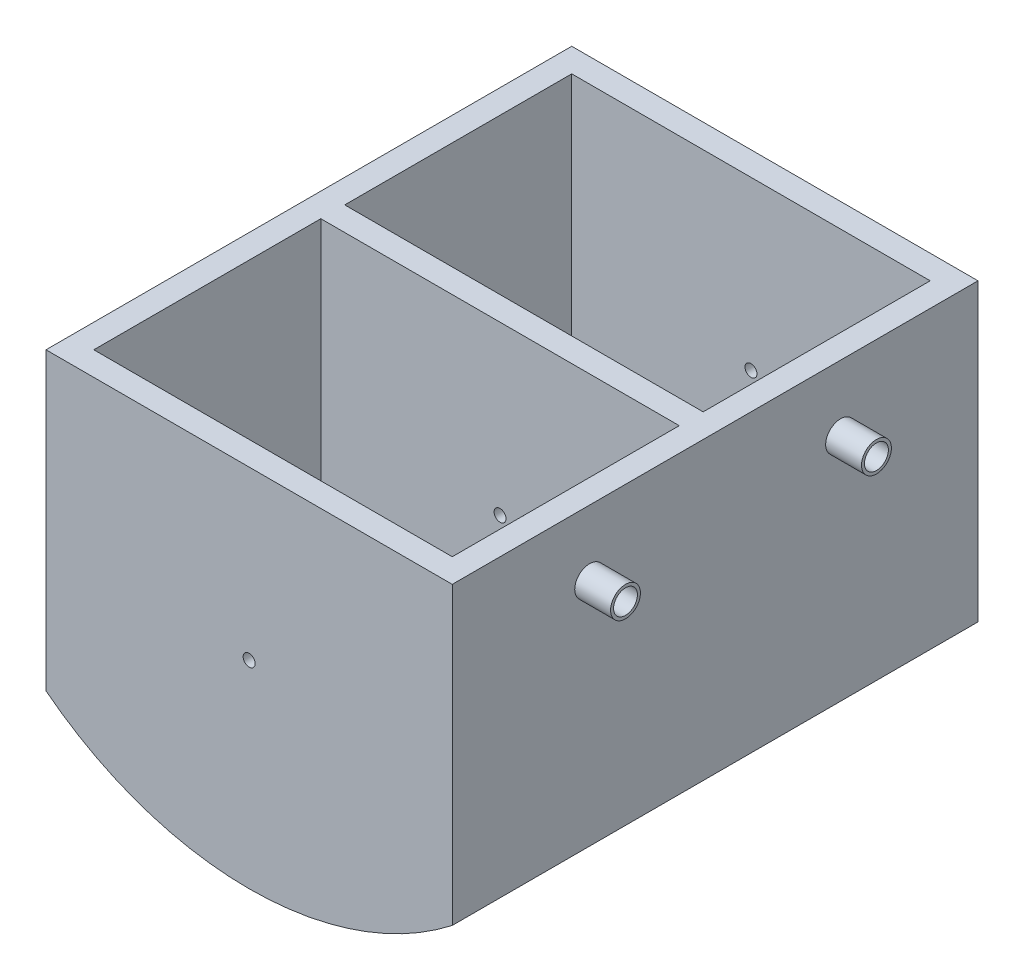
ISO-10303-21;
HEADER;
FILE_DESCRIPTION(('STEP AP214'),'2;1');
FILE_NAME('part.step','',(''),(''),'','','');
FILE_SCHEMA(('AUTOMOTIVE_DESIGN { 1 0 10303 214 1 1 1 1 }'));
ENDSEC;
DATA;
#1=APPLICATION_CONTEXT('core data for automotive mechanical design processes');
#2=APPLICATION_PROTOCOL_DEFINITION('international standard','automotive_design',2000,#1);
#3=PRODUCT_CONTEXT('',#1,'mechanical');
#4=PRODUCT('Part','Part','',(#3));
#5=PRODUCT_RELATED_PRODUCT_CATEGORY('part','',(#4));
#6=PRODUCT_DEFINITION_FORMATION('','',#4);
#7=PRODUCT_DEFINITION_CONTEXT('part definition',#1,'design');
#8=PRODUCT_DEFINITION('design','',#6,#7);
#9=PRODUCT_DEFINITION_SHAPE('','',#8);
#10=(LENGTH_UNIT() NAMED_UNIT(*) SI_UNIT(.MILLI.,.METRE.));
#11=(NAMED_UNIT(*) PLANE_ANGLE_UNIT() SI_UNIT($,.RADIAN.));
#12=(NAMED_UNIT(*) SI_UNIT($,.STERADIAN.) SOLID_ANGLE_UNIT());
#13=UNCERTAINTY_MEASURE_WITH_UNIT(LENGTH_MEASURE(1.E-05),#10,'distance_accuracy_value','');
#14=(GEOMETRIC_REPRESENTATION_CONTEXT(3) GLOBAL_UNCERTAINTY_ASSIGNED_CONTEXT((#13)) GLOBAL_UNIT_ASSIGNED_CONTEXT((#10,
#11,#12)) REPRESENTATION_CONTEXT('',''));
#15=CARTESIAN_POINT('',(0.,0.,0.));
#16=DIRECTION('',(0.,0.,1.));
#17=DIRECTION('',(1.,0.,0.));
#18=AXIS2_PLACEMENT_3D('',#15,#16,#17);
#19=CARTESIAN_POINT('',(170.,140.,440.));
#20=DIRECTION('',(-1.,0.,0.));
#21=DIRECTION('',(0.,0.,1.));
#22=AXIS2_PLACEMENT_3D('',#19,#20,#21);
#23=PLANE('',#22);
#24=CARTESIAN_POINT('',(170.,85.,325.));
#25=DIRECTION('',(-1.,0.,0.));
#26=DIRECTION('',(0.,0.,1.));
#27=AXIS2_PLACEMENT_3D('',#24,#25,#26);
#28=CIRCLE('',#27,12.5);
#29=CARTESIAN_POINT('',(170.,85.,337.5));
#30=VERTEX_POINT('',#29);
#31=EDGE_CURVE('E57',#30,#30,#28,.F.);
#32=ORIENTED_EDGE('',*,*,#31,.F.);
#33=EDGE_LOOP('',(#32));
#34=FACE_BOUND('',#33,.T.);
#35=DIRECTION('',(0.,1.,0.));
#36=VECTOR('',#35,1.);
#37=CARTESIAN_POINT('',(170.,140.,440.));
#38=LINE('',#37,#36);
#39=CARTESIAN_POINT('',(170.,-107.237017076077,440.));
#40=VERTEX_POINT('',#39);
#41=CARTESIAN_POINT('',(170.,140.,440.));
#42=VERTEX_POINT('',#41);
#43=EDGE_CURVE('E198',#40,#42,#38,.T.);
#44=ORIENTED_EDGE('',*,*,#43,.F.);
#45=DIRECTION('',(0.,0.,-1.));
#46=VECTOR('',#45,1.);
#47=CARTESIAN_POINT('',(170.,-107.237017076077,786.284114121395));
#48=LINE('',#47,#46);
#49=CARTESIAN_POINT('',(170.,-107.237017076077,0.));
#50=VERTEX_POINT('',#49);
#51=EDGE_CURVE('E208',#40,#50,#48,.T.);
#52=ORIENTED_EDGE('',*,*,#51,.T.);
#53=DIRECTION('',(0.,1.,0.));
#54=VECTOR('',#53,1.);
#55=CARTESIAN_POINT('',(170.,140.,0.));
#56=LINE('',#55,#54);
#57=CARTESIAN_POINT('',(170.,140.,0.));
#58=VERTEX_POINT('',#57);
#59=EDGE_CURVE('E362',#50,#58,#56,.T.);
#60=ORIENTED_EDGE('',*,*,#59,.T.);
#61=DIRECTION('',(0.,0.,-1.));
#62=VECTOR('',#61,1.);
#63=CARTESIAN_POINT('',(170.,140.,440.));
#64=LINE('',#63,#62);
#65=EDGE_CURVE('E368',#42,#58,#64,.T.);
#66=ORIENTED_EDGE('',*,*,#65,.F.);
#67=EDGE_LOOP('',(#44,#52,#60,#66));
#68=FACE_BOUND('',#67,.T.);
#69=CARTESIAN_POINT('',(170.,85.,115.));
#70=DIRECTION('',(-1.,0.,0.));
#71=DIRECTION('',(0.,0.,1.));
#72=AXIS2_PLACEMENT_3D('',#69,#70,#71);
#73=CIRCLE('',#72,12.5);
#74=CARTESIAN_POINT('',(170.,85.,127.5));
#75=VERTEX_POINT('',#74);
#76=EDGE_CURVE('E11',#75,#75,#73,.F.);
#77=ORIENTED_EDGE('',*,*,#76,.F.);
#78=EDGE_LOOP('',(#77));
#79=FACE_BOUND('',#78,.T.);
#80=ADVANCED_FACE('F49',(#34,#68,#79),#23,.F.);
#81=CARTESIAN_POINT('',(0.,110.833333333333,20.));
#82=DIRECTION('',(0.,0.,1.));
#83=DIRECTION('',(1.,0.,0.));
#84=AXIS2_PLACEMENT_3D('',#81,#82,#83);
#85=CYLINDRICAL_SURFACE('',#84,250.833333333333);
#86=DIRECTION('',(0.,0.,1.));
#87=VECTOR('',#86,1.);
#88=CARTESIAN_POINT('',(-80.,-126.900469713501,20.));
#89=LINE('',#88,#87);
#90=CARTESIAN_POINT('',(-80.,-126.900469713501,20.));
#91=VERTEX_POINT('',#90);
#92=CARTESIAN_POINT('',(-80.,-126.900469713501,210.));
#93=VERTEX_POINT('',#92);
#94=EDGE_CURVE('E72',#91,#93,#89,.T.);
#95=ORIENTED_EDGE('',*,*,#94,.F.);
#96=CARTESIAN_POINT('',(0.,110.833333333333,20.));
#97=DIRECTION('',(0.,0.,1.));
#98=DIRECTION('',(1.,0.,0.));
#99=AXIS2_PLACEMENT_3D('',#96,#97,#98);
#100=CIRCLE('',#99,250.833333333333);
#101=CARTESIAN_POINT('',(-150.,-90.2073618283952,20.));
#102=VERTEX_POINT('',#101);
#103=EDGE_CURVE('E330',#102,#91,#100,.T.);
#104=ORIENTED_EDGE('',*,*,#103,.F.);
#105=DIRECTION('',(0.,0.,1.));
#106=VECTOR('',#105,1.);
#107=CARTESIAN_POINT('',(-150.,-90.2073618283952,20.));
#108=LINE('',#107,#106);
#109=CARTESIAN_POINT('',(-150.,-90.2073618283952,210.));
#110=VERTEX_POINT('',#109);
#111=EDGE_CURVE('E353',#102,#110,#108,.T.);
#112=ORIENTED_EDGE('',*,*,#111,.T.);
#113=CARTESIAN_POINT('',(0.,110.833333333333,210.));
#114=DIRECTION('',(0.,0.,1.));
#115=DIRECTION('',(1.,0.,0.));
#116=AXIS2_PLACEMENT_3D('',#113,#114,#115);
#117=CIRCLE('',#116,250.833333333333);
#118=EDGE_CURVE('E295',#93,#110,#117,.F.);
#119=ORIENTED_EDGE('',*,*,#118,.F.);
#120=EDGE_LOOP('',(#95,#104,#112,#119));
#121=FACE_BOUND('',#120,.T.);
#122=ADVANCED_FACE('F384',(#121),#85,.F.);
#123=DIRECTION('',(0.,0.,1.));
#124=VECTOR('',#123,1.);
#125=CARTESIAN_POINT('',(80.,-126.900469713501,20.));
#126=LINE('',#125,#124);
#127=CARTESIAN_POINT('',(80.,-126.900469713501,20.));
#128=VERTEX_POINT('',#127);
#129=CARTESIAN_POINT('',(80.,-126.900469713501,210.));
#130=VERTEX_POINT('',#129);
#131=EDGE_CURVE('E242',#128,#130,#126,.T.);
#132=ORIENTED_EDGE('',*,*,#131,.T.);
#133=CARTESIAN_POINT('',(150.,-90.2073618283952,210.));
#134=VERTEX_POINT('',#133);
#135=EDGE_CURVE('E296',#134,#130,#117,.F.);
#136=ORIENTED_EDGE('',*,*,#135,.F.);
#137=DIRECTION('',(0.,0.,1.));
#138=VECTOR('',#137,1.);
#139=CARTESIAN_POINT('',(150.,-90.2073618283953,20.));
#140=LINE('',#139,#138);
#141=CARTESIAN_POINT('',(150.,-90.2073618283953,20.));
#142=VERTEX_POINT('',#141);
#143=EDGE_CURVE('E349',#142,#134,#140,.T.);
#144=ORIENTED_EDGE('',*,*,#143,.F.);
#145=EDGE_CURVE('E329',#128,#142,#100,.T.);
#146=ORIENTED_EDGE('',*,*,#145,.F.);
#147=EDGE_LOOP('',(#132,#136,#144,#146));
#148=FACE_BOUND('',#147,.T.);
#149=ADVANCED_FACE('F472',(#148),#85,.F.);
#150=DIRECTION('',(0.,0.,1.));
#151=VECTOR('',#150,1.);
#152=CARTESIAN_POINT('',(80.,-126.900469713501,20.));
#153=LINE('',#152,#151);
#154=CARTESIAN_POINT('',(80.,-126.900469713501,420.));
#155=VERTEX_POINT('',#154);
#156=CARTESIAN_POINT('',(80.,-126.900469713501,230.));
#157=VERTEX_POINT('',#156);
#158=EDGE_CURVE('E272',#155,#157,#153,.F.);
#159=ORIENTED_EDGE('',*,*,#158,.F.);
#160=CARTESIAN_POINT('',(0.,110.833333333333,420.));
#161=DIRECTION('',(0.,0.,1.));
#162=DIRECTION('',(1.,0.,0.));
#163=AXIS2_PLACEMENT_3D('',#160,#161,#162);
#164=CIRCLE('',#163,250.833333333333);
#165=CARTESIAN_POINT('',(150.,-90.2073618283953,420.));
#166=VERTEX_POINT('',#165);
#167=EDGE_CURVE('E316',#155,#166,#164,.T.);
#168=ORIENTED_EDGE('',*,*,#167,.T.);
#169=CARTESIAN_POINT('',(150.,-90.2073618283952,230.));
#170=VERTEX_POINT('',#169);
#171=EDGE_CURVE('E352',#170,#166,#140,.T.);
#172=ORIENTED_EDGE('',*,*,#171,.F.);
#173=CARTESIAN_POINT('',(0.,110.833333333333,230.));
#174=DIRECTION('',(0.,0.,1.));
#175=DIRECTION('',(1.,0.,0.));
#176=AXIS2_PLACEMENT_3D('',#173,#174,#175);
#177=CIRCLE('',#176,250.833333333333);
#178=EDGE_CURVE('E287',#170,#157,#177,.F.);
#179=ORIENTED_EDGE('',*,*,#178,.T.);
#180=EDGE_LOOP('',(#159,#168,#172,#179));
#181=FACE_BOUND('',#180,.T.);
#182=ADVANCED_FACE('F468',(#181),#85,.F.);
#183=DIRECTION('',(0.,0.,1.));
#184=VECTOR('',#183,1.);
#185=CARTESIAN_POINT('',(-79.9999999999999,-126.900469713501,20.));
#186=LINE('',#185,#184);
#187=CARTESIAN_POINT('',(-79.9999999999999,-126.900469713501,230.));
#188=VERTEX_POINT('',#187);
#189=CARTESIAN_POINT('',(-79.9999999999999,-126.900469713501,420.));
#190=VERTEX_POINT('',#189);
#191=EDGE_CURVE('E267',#188,#190,#186,.T.);
#192=ORIENTED_EDGE('',*,*,#191,.F.);
#193=CARTESIAN_POINT('',(-150.,-90.2073618283952,230.));
#194=VERTEX_POINT('',#193);
#195=EDGE_CURVE('E285',#188,#194,#177,.F.);
#196=ORIENTED_EDGE('',*,*,#195,.T.);
#197=CARTESIAN_POINT('',(-150.,-90.2073618283952,420.));
#198=VERTEX_POINT('',#197);
#199=EDGE_CURVE('E339',#194,#198,#108,.T.);
#200=ORIENTED_EDGE('',*,*,#199,.T.);
#201=EDGE_CURVE('E317',#198,#190,#164,.T.);
#202=ORIENTED_EDGE('',*,*,#201,.T.);
#203=EDGE_LOOP('',(#192,#196,#200,#202));
#204=FACE_BOUND('',#203,.T.);
#205=ADVANCED_FACE('F471',(#204),#85,.F.);
#206=CARTESIAN_POINT('',(-150.,0.,20.));
#207=DIRECTION('',(-1.,0.,0.));
#208=DIRECTION('',(0.,-1.,0.));
#209=AXIS2_PLACEMENT_3D('',#206,#207,#208);
#210=PLANE('',#209);
#211=DIRECTION('',(0.,1.,0.));
#212=VECTOR('',#211,1.);
#213=CARTESIAN_POINT('',(-150.,0.,210.));
#214=LINE('',#213,#212);
#215=CARTESIAN_POINT('',(-150.,140.,210.));
#216=VERTEX_POINT('',#215);
#217=EDGE_CURVE('E302',#110,#216,#214,.T.);
#218=ORIENTED_EDGE('',*,*,#217,.F.);
#219=ORIENTED_EDGE('',*,*,#111,.F.);
#220=DIRECTION('',(0.,-1.,0.));
#221=VECTOR('',#220,1.);
#222=CARTESIAN_POINT('',(-150.,0.,20.));
#223=LINE('',#222,#221);
#224=CARTESIAN_POINT('',(-150.,140.,20.));
#225=VERTEX_POINT('',#224);
#226=EDGE_CURVE('E326',#225,#102,#223,.T.);
#227=ORIENTED_EDGE('',*,*,#226,.F.);
#228=DIRECTION('',(0.,0.,1.));
#229=VECTOR('',#228,1.);
#230=CARTESIAN_POINT('',(-150.,140.,20.));
#231=LINE('',#230,#229);
#232=EDGE_CURVE('E340',#225,#216,#231,.T.);
#233=ORIENTED_EDGE('',*,*,#232,.T.);
#234=EDGE_LOOP('',(#218,#219,#227,#233));
#235=FACE_BOUND('',#234,.T.);
#236=ADVANCED_FACE('F477',(#235),#210,.F.);
#237=CARTESIAN_POINT('',(150.,0.,20.));
#238=DIRECTION('',(-1.,0.,0.));
#239=DIRECTION('',(0.,-1.,0.));
#240=AXIS2_PLACEMENT_3D('',#237,#238,#239);
#241=PLANE('',#240);
#242=CARTESIAN_POINT('',(150.,85.,115.));
#243=DIRECTION('',(-1.,0.,0.));
#244=DIRECTION('',(0.,-1.,0.));
#245=AXIS2_PLACEMENT_3D('',#242,#243,#244);
#246=CIRCLE('',#245,9.99999999999999);
#247=CARTESIAN_POINT('',(150.,75.,115.));
#248=VERTEX_POINT('',#247);
#249=EDGE_CURVE('E229',#248,#248,#246,.T.);
#250=ORIENTED_EDGE('',*,*,#249,.F.);
#251=EDGE_LOOP('',(#250));
#252=FACE_BOUND('',#251,.T.);
#253=ORIENTED_EDGE('',*,*,#143,.T.);
#254=DIRECTION('',(0.,1.,0.));
#255=VECTOR('',#254,1.);
#256=CARTESIAN_POINT('',(150.,0.,210.));
#257=LINE('',#256,#255);
#258=CARTESIAN_POINT('',(150.,140.,210.));
#259=VERTEX_POINT('',#258);
#260=EDGE_CURVE('E299',#134,#259,#257,.T.);
#261=ORIENTED_EDGE('',*,*,#260,.T.);
#262=DIRECTION('',(0.,0.,1.));
#263=VECTOR('',#262,1.);
#264=CARTESIAN_POINT('',(150.,140.,20.));
#265=LINE('',#264,#263);
#266=CARTESIAN_POINT('',(150.,140.,20.));
#267=VERTEX_POINT('',#266);
#268=EDGE_CURVE('E345',#267,#259,#265,.T.);
#269=ORIENTED_EDGE('',*,*,#268,.F.);
#270=DIRECTION('',(0.,-1.,0.));
#271=VECTOR('',#270,1.);
#272=CARTESIAN_POINT('',(150.,0.,20.));
#273=LINE('',#272,#271);
#274=EDGE_CURVE('E333',#267,#142,#273,.T.);
#275=ORIENTED_EDGE('',*,*,#274,.T.);
#276=EDGE_LOOP('',(#253,#261,#269,#275));
#277=FACE_BOUND('',#276,.T.);
#278=ADVANCED_FACE('F467',(#252,#277),#241,.T.);
#279=ORIENTED_EDGE('',*,*,#199,.F.);
#280=DIRECTION('',(0.,1.,0.));
#281=VECTOR('',#280,1.);
#282=CARTESIAN_POINT('',(-150.,0.,230.));
#283=LINE('',#282,#281);
#284=CARTESIAN_POINT('',(-150.,140.,230.));
#285=VERTEX_POINT('',#284);
#286=EDGE_CURVE('E292',#194,#285,#283,.T.);
#287=ORIENTED_EDGE('',*,*,#286,.T.);
#288=CARTESIAN_POINT('',(-150.,140.,420.));
#289=VERTEX_POINT('',#288);
#290=EDGE_CURVE('E344',#285,#289,#231,.T.);
#291=ORIENTED_EDGE('',*,*,#290,.T.);
#292=DIRECTION('',(0.,-1.,0.));
#293=VECTOR('',#292,1.);
#294=CARTESIAN_POINT('',(-150.,140.,420.));
#295=LINE('',#294,#293);
#296=EDGE_CURVE('E313',#289,#198,#295,.T.);
#297=ORIENTED_EDGE('',*,*,#296,.T.);
#298=EDGE_LOOP('',(#279,#287,#291,#297));
#299=FACE_BOUND('',#298,.T.);
#300=ADVANCED_FACE('F465',(#299),#210,.F.);
#301=CARTESIAN_POINT('',(150.,85.,325.));
#302=DIRECTION('',(-1.,0.,0.));
#303=DIRECTION('',(0.,-1.,0.));
#304=AXIS2_PLACEMENT_3D('',#301,#302,#303);
#305=CIRCLE('',#304,10.);
#306=CARTESIAN_POINT('',(150.,75.,325.));
#307=VERTEX_POINT('',#306);
#308=EDGE_CURVE('E232',#307,#307,#305,.T.);
#309=ORIENTED_EDGE('',*,*,#308,.F.);
#310=EDGE_LOOP('',(#309));
#311=FACE_BOUND('',#310,.T.);
#312=DIRECTION('',(0.,1.,0.));
#313=VECTOR('',#312,1.);
#314=CARTESIAN_POINT('',(150.,0.,230.));
#315=LINE('',#314,#313);
#316=CARTESIAN_POINT('',(150.,140.,230.));
#317=VERTEX_POINT('',#316);
#318=EDGE_CURVE('E290',#170,#317,#315,.T.);
#319=ORIENTED_EDGE('',*,*,#318,.F.);
#320=ORIENTED_EDGE('',*,*,#171,.T.);
#321=DIRECTION('',(0.,1.,0.));
#322=VECTOR('',#321,1.);
#323=CARTESIAN_POINT('',(150.,140.,420.));
#324=LINE('',#323,#322);
#325=CARTESIAN_POINT('',(150.,140.,420.));
#326=VERTEX_POINT('',#325);
#327=EDGE_CURVE('E320',#166,#326,#324,.T.);
#328=ORIENTED_EDGE('',*,*,#327,.T.);
#329=EDGE_CURVE('E348',#317,#326,#265,.T.);
#330=ORIENTED_EDGE('',*,*,#329,.F.);
#331=EDGE_LOOP('',(#319,#320,#328,#330));
#332=FACE_BOUND('',#331,.T.);
#333=ADVANCED_FACE('F461',(#311,#332),#241,.T.);
#334=CARTESIAN_POINT('',(0.,0.,440.));
#335=DIRECTION('',(0.,0.,-1.));
#336=DIRECTION('',(-1.,0.,0.));
#337=AXIS2_PLACEMENT_3D('',#334,#335,#336);
#338=CYLINDRICAL_SURFACE('',#337,5.);
#339=CARTESIAN_POINT('',(0.,0.,0.));
#340=DIRECTION('',(0.,0.,1.));
#341=DIRECTION('',(1.,0.,0.));
#342=AXIS2_PLACEMENT_3D('',#339,#340,#341);
#343=CIRCLE('',#342,5.);
#344=CARTESIAN_POINT('',(5.,0.,0.));
#345=VERTEX_POINT('',#344);
#346=EDGE_CURVE('E343',#345,#345,#343,.T.);
#347=ORIENTED_EDGE('',*,*,#346,.F.);
#348=EDGE_LOOP('',(#347));
#349=FACE_BOUND('',#348,.T.);
#350=CARTESIAN_POINT('',(0.,0.,20.));
#351=DIRECTION('',(0.,0.,1.));
#352=DIRECTION('',(1.,0.,0.));
#353=AXIS2_PLACEMENT_3D('',#350,#351,#352);
#354=CIRCLE('',#353,5.);
#355=CARTESIAN_POINT('',(5.,0.,20.));
#356=VERTEX_POINT('',#355);
#357=EDGE_CURVE('E323',#356,#356,#354,.F.);
#358=ORIENTED_EDGE('',*,*,#357,.F.);
#359=EDGE_LOOP('',(#358));
#360=FACE_BOUND('',#359,.T.);
#361=ADVANCED_FACE('F464',(#349,#360),#338,.F.);
#362=CARTESIAN_POINT('',(0.,110.833333333333,440.));
#363=DIRECTION('',(0.,0.,1.));
#364=DIRECTION('',(1.,0.,0.));
#365=AXIS2_PLACEMENT_3D('',#362,#363,#364);
#366=PLANE('',#365);
#367=DIRECTION('',(-1.,0.,0.));
#368=VECTOR('',#367,1.);
#369=CARTESIAN_POINT('',(-170.,140.,440.));
#370=LINE('',#369,#368);
#371=CARTESIAN_POINT('',(-170.,140.,440.));
#372=VERTEX_POINT('',#371);
#373=EDGE_CURVE('E195',#42,#372,#370,.T.);
#374=ORIENTED_EDGE('',*,*,#373,.T.);
#375=DIRECTION('',(0.,-1.,0.));
#376=VECTOR('',#375,1.);
#377=CARTESIAN_POINT('',(-170.,140.,440.));
#378=LINE('',#377,#376);
#379=CARTESIAN_POINT('',(-170.,-107.237017076077,440.));
#380=VERTEX_POINT('',#379);
#381=EDGE_CURVE('E187',#372,#380,#378,.T.);
#382=ORIENTED_EDGE('',*,*,#381,.T.);
#383=CARTESIAN_POINT('',(0.,110.833333333333,440.));
#384=DIRECTION('',(0.,0.,1.));
#385=DIRECTION('',(1.,0.,0.));
#386=AXIS2_PLACEMENT_3D('',#383,#384,#385);
#387=CIRCLE('',#386,276.504390069458);
#388=EDGE_CURVE('E192',#40,#380,#387,.F.);
#389=ORIENTED_EDGE('',*,*,#388,.F.);
#390=ORIENTED_EDGE('',*,*,#43,.T.);
#391=EDGE_LOOP('',(#374,#382,#389,#390));
#392=FACE_BOUND('',#391,.T.);
#393=CARTESIAN_POINT('',(0.,0.,440.));
#394=DIRECTION('',(0.,0.,1.));
#395=DIRECTION('',(1.,0.,0.));
#396=AXIS2_PLACEMENT_3D('',#393,#394,#395);
#397=CIRCLE('',#396,5.);
#398=CARTESIAN_POINT('',(5.,0.,440.));
#399=VERTEX_POINT('',#398);
#400=EDGE_CURVE('E304',#399,#399,#397,.T.);
#401=ORIENTED_EDGE('',*,*,#400,.F.);
#402=EDGE_LOOP('',(#401));
#403=FACE_BOUND('',#402,.T.);
#404=ADVANCED_FACE('F189',(#392,#403),#366,.T.);
#405=CARTESIAN_POINT('',(0.,110.833333333333,0.));
#406=DIRECTION('',(0.,0.,1.));
#407=DIRECTION('',(1.,0.,0.));
#408=AXIS2_PLACEMENT_3D('',#405,#406,#407);
#409=PLANE('',#408);
#410=DIRECTION('',(0.,-1.,0.));
#411=VECTOR('',#410,1.);
#412=CARTESIAN_POINT('',(-170.,140.,0.));
#413=LINE('',#412,#411);
#414=CARTESIAN_POINT('',(-170.,140.,0.));
#415=VERTEX_POINT('',#414);
#416=CARTESIAN_POINT('',(-170.,-107.237017076077,0.));
#417=VERTEX_POINT('',#416);
#418=EDGE_CURVE('E204',#415,#417,#413,.T.);
#419=ORIENTED_EDGE('',*,*,#418,.F.);
#420=DIRECTION('',(-1.,0.,0.));
#421=VECTOR('',#420,1.);
#422=CARTESIAN_POINT('',(-170.,140.,0.));
#423=LINE('',#422,#421);
#424=EDGE_CURVE('E199',#58,#415,#423,.T.);
#425=ORIENTED_EDGE('',*,*,#424,.F.);
#426=ORIENTED_EDGE('',*,*,#59,.F.);
#427=CARTESIAN_POINT('',(0.,110.833333333333,0.));
#428=DIRECTION('',(0.,0.,-1.));
#429=DIRECTION('',(-1.,0.,0.));
#430=AXIS2_PLACEMENT_3D('',#427,#428,#429);
#431=CIRCLE('',#430,276.504390069458);
#432=EDGE_CURVE('E212',#50,#417,#431,.T.);
#433=ORIENTED_EDGE('',*,*,#432,.T.);
#434=EDGE_LOOP('',(#419,#425,#426,#433));
#435=FACE_BOUND('',#434,.T.);
#436=ORIENTED_EDGE('',*,*,#346,.T.);
#437=EDGE_LOOP('',(#436));
#438=FACE_BOUND('',#437,.T.);
#439=ADVANCED_FACE('F483',(#435,#438),#409,.F.);
#440=CARTESIAN_POINT('',(-170.,140.,440.));
#441=DIRECTION('',(1.,0.,0.));
#442=DIRECTION('',(0.,1.,0.));
#443=AXIS2_PLACEMENT_3D('',#440,#441,#442);
#444=PLANE('',#443);
#445=DIRECTION('',(0.,0.,-1.));
#446=VECTOR('',#445,1.);
#447=CARTESIAN_POINT('',(-170.,140.,440.));
#448=LINE('',#447,#446);
#449=EDGE_CURVE('E360',#372,#415,#448,.T.);
#450=ORIENTED_EDGE('',*,*,#449,.T.);
#451=ORIENTED_EDGE('',*,*,#418,.T.);
#452=DIRECTION('',(0.,0.,-1.));
#453=VECTOR('',#452,1.);
#454=CARTESIAN_POINT('',(-170.,-107.237017076077,786.284114121395));
#455=LINE('',#454,#453);
#456=EDGE_CURVE('E202',#380,#417,#455,.T.);
#457=ORIENTED_EDGE('',*,*,#456,.F.);
#458=ORIENTED_EDGE('',*,*,#381,.F.);
#459=EDGE_LOOP('',(#450,#451,#457,#458));
#460=FACE_BOUND('',#459,.T.);
#461=ADVANCED_FACE('F51',(#460),#444,.F.);
#462=CARTESIAN_POINT('',(-170.,140.,440.));
#463=DIRECTION('',(0.,-1.,0.));
#464=DIRECTION('',(0.,0.,-1.));
#465=AXIS2_PLACEMENT_3D('',#462,#463,#464);
#466=PLANE('',#465);
#467=ORIENTED_EDGE('',*,*,#290,.F.);
#468=DIRECTION('',(-1.,0.,0.));
#469=VECTOR('',#468,1.);
#470=CARTESIAN_POINT('',(-170.,140.,230.));
#471=LINE('',#470,#469);
#472=EDGE_CURVE('E279',#317,#285,#471,.T.);
#473=ORIENTED_EDGE('',*,*,#472,.F.);
#474=ORIENTED_EDGE('',*,*,#329,.T.);
#475=DIRECTION('',(-1.,0.,0.));
#476=VECTOR('',#475,1.);
#477=CARTESIAN_POINT('',(-150.,140.,420.));
#478=LINE('',#477,#476);
#479=EDGE_CURVE('E308',#326,#289,#478,.T.);
#480=ORIENTED_EDGE('',*,*,#479,.T.);
#481=EDGE_LOOP('',(#467,#473,#474,#480));
#482=FACE_BOUND('',#481,.T.);
#483=ORIENTED_EDGE('',*,*,#268,.T.);
#484=DIRECTION('',(-1.,0.,0.));
#485=VECTOR('',#484,1.);
#486=CARTESIAN_POINT('',(-170.,140.,210.));
#487=LINE('',#486,#485);
#488=EDGE_CURVE('E282',#259,#216,#487,.T.);
#489=ORIENTED_EDGE('',*,*,#488,.T.);
#490=ORIENTED_EDGE('',*,*,#232,.F.);
#491=DIRECTION('',(-1.,0.,0.));
#492=VECTOR('',#491,1.);
#493=CARTESIAN_POINT('',(0.,140.,20.));
#494=LINE('',#493,#492);
#495=EDGE_CURVE('E336',#267,#225,#494,.T.);
#496=ORIENTED_EDGE('',*,*,#495,.F.);
#497=EDGE_LOOP('',(#483,#489,#490,#496));
#498=FACE_BOUND('',#497,.T.);
#499=ORIENTED_EDGE('',*,*,#65,.T.);
#500=ORIENTED_EDGE('',*,*,#424,.T.);
#501=ORIENTED_EDGE('',*,*,#449,.F.);
#502=ORIENTED_EDGE('',*,*,#373,.F.);
#503=EDGE_LOOP('',(#499,#500,#501,#502));
#504=FACE_BOUND('',#503,.T.);
#505=ADVANCED_FACE('F459',(#482,#498,#504),#466,.F.);
#506=CARTESIAN_POINT('',(0.,0.,20.));
#507=DIRECTION('',(0.,0.,1.));
#508=DIRECTION('',(1.,0.,0.));
#509=AXIS2_PLACEMENT_3D('',#506,#507,#508);
#510=PLANE('',#509);
#511=ORIENTED_EDGE('',*,*,#357,.T.);
#512=EDGE_LOOP('',(#511));
#513=FACE_BOUND('',#512,.T.);
#514=ORIENTED_EDGE('',*,*,#226,.T.);
#515=ORIENTED_EDGE('',*,*,#103,.T.);
#516=DIRECTION('',(0.,1.,0.));
#517=VECTOR('',#516,1.);
#518=CARTESIAN_POINT('',(-80.,-126.900469713501,20.));
#519=LINE('',#518,#517);
#520=CARTESIAN_POINT('',(-80.,-147.91498925919,20.));
#521=VERTEX_POINT('',#520);
#522=EDGE_CURVE('E236',#521,#91,#519,.T.);
#523=ORIENTED_EDGE('',*,*,#522,.F.);
#524=CARTESIAN_POINT('',(0.,110.833333333333,20.));
#525=DIRECTION('',(0.,0.,-1.));
#526=DIRECTION('',(-1.,0.,0.));
#527=AXIS2_PLACEMENT_3D('',#524,#525,#526);
#528=CIRCLE('',#527,270.833333333333);
#529=CARTESIAN_POINT('',(80.,-147.91498925919,20.));
#530=VERTEX_POINT('',#529);
#531=EDGE_CURVE('E376',#530,#521,#528,.T.);
#532=ORIENTED_EDGE('',*,*,#531,.F.);
#533=DIRECTION('',(0.,-1.,0.));
#534=VECTOR('',#533,1.);
#535=CARTESIAN_POINT('',(80.,-126.900469713501,20.));
#536=LINE('',#535,#534);
#537=EDGE_CURVE('E238',#128,#530,#536,.T.);
#538=ORIENTED_EDGE('',*,*,#537,.F.);
#539=ORIENTED_EDGE('',*,*,#145,.T.);
#540=ORIENTED_EDGE('',*,*,#274,.F.);
#541=ORIENTED_EDGE('',*,*,#495,.T.);
#542=EDGE_LOOP('',(#514,#515,#523,#532,#538,#539,#540,#541));
#543=FACE_BOUND('',#542,.T.);
#544=ADVANCED_FACE('F455',(#513,#543),#510,.T.);
#545=CARTESIAN_POINT('',(0.,110.833333333333,420.));
#546=DIRECTION('',(0.,0.,1.));
#547=DIRECTION('',(1.,0.,0.));
#548=AXIS2_PLACEMENT_3D('',#545,#546,#547);
#549=PLANE('',#548);
#550=ORIENTED_EDGE('',*,*,#167,.F.);
#551=DIRECTION('',(0.,1.,0.));
#552=VECTOR('',#551,1.);
#553=CARTESIAN_POINT('',(80.,-157.87283265072,420.));
#554=LINE('',#553,#552);
#555=CARTESIAN_POINT('',(80.,-147.91498925919,420.));
#556=VERTEX_POINT('',#555);
#557=EDGE_CURVE('E255',#556,#155,#554,.T.);
#558=ORIENTED_EDGE('',*,*,#557,.F.);
#559=CARTESIAN_POINT('',(0.,110.833333333333,420.));
#560=DIRECTION('',(0.,0.,1.));
#561=DIRECTION('',(1.,0.,0.));
#562=AXIS2_PLACEMENT_3D('',#559,#560,#561);
#563=CIRCLE('',#562,270.833333333333);
#564=CARTESIAN_POINT('',(-80.,-147.91498925919,420.));
#565=VERTEX_POINT('',#564);
#566=EDGE_CURVE('E373',#565,#556,#563,.T.);
#567=ORIENTED_EDGE('',*,*,#566,.F.);
#568=DIRECTION('',(0.,-1.,0.));
#569=VECTOR('',#568,1.);
#570=CARTESIAN_POINT('',(-80.,-157.87283265072,420.));
#571=LINE('',#570,#569);
#572=EDGE_CURVE('E257',#190,#565,#571,.T.);
#573=ORIENTED_EDGE('',*,*,#572,.F.);
#574=ORIENTED_EDGE('',*,*,#201,.F.);
#575=ORIENTED_EDGE('',*,*,#296,.F.);
#576=ORIENTED_EDGE('',*,*,#479,.F.);
#577=ORIENTED_EDGE('',*,*,#327,.F.);
#578=EDGE_LOOP('',(#550,#558,#567,#573,#574,#575,#576,#577));
#579=FACE_BOUND('',#578,.T.);
#580=CARTESIAN_POINT('',(0.,0.,420.));
#581=DIRECTION('',(0.,0.,1.));
#582=DIRECTION('',(1.,0.,0.));
#583=AXIS2_PLACEMENT_3D('',#580,#581,#582);
#584=CIRCLE('',#583,5.);
#585=CARTESIAN_POINT('',(5.,0.,420.));
#586=VERTEX_POINT('',#585);
#587=EDGE_CURVE('E305',#586,#586,#584,.T.);
#588=ORIENTED_EDGE('',*,*,#587,.T.);
#589=EDGE_LOOP('',(#588));
#590=FACE_BOUND('',#589,.T.);
#591=ADVANCED_FACE('F451',(#579,#590),#549,.F.);
#592=CARTESIAN_POINT('',(0.,0.,420.));
#593=DIRECTION('',(0.,0.,1.));
#594=DIRECTION('',(1.,0.,0.));
#595=AXIS2_PLACEMENT_3D('',#592,#593,#594);
#596=CYLINDRICAL_SURFACE('',#595,5.);
#597=ORIENTED_EDGE('',*,*,#587,.F.);
#598=EDGE_LOOP('',(#597));
#599=FACE_BOUND('',#598,.T.);
#600=ORIENTED_EDGE('',*,*,#400,.T.);
#601=EDGE_LOOP('',(#600));
#602=FACE_BOUND('',#601,.T.);
#603=ADVANCED_FACE('F444',(#599,#602),#596,.F.);
#604=CARTESIAN_POINT('',(0.,110.833333333333,210.));
#605=DIRECTION('',(0.,0.,1.));
#606=DIRECTION('',(1.,0.,0.));
#607=AXIS2_PLACEMENT_3D('',#604,#605,#606);
#608=PLANE('',#607);
#609=CARTESIAN_POINT('',(0.,0.,210.));
#610=DIRECTION('',(0.,0.,1.));
#611=DIRECTION('',(1.,0.,0.));
#612=AXIS2_PLACEMENT_3D('',#609,#610,#611);
#613=CIRCLE('',#612,5.);
#614=CARTESIAN_POINT('',(5.,0.,210.));
#615=VERTEX_POINT('',#614);
#616=EDGE_CURVE('E276',#615,#615,#613,.T.);
#617=ORIENTED_EDGE('',*,*,#616,.T.);
#618=EDGE_LOOP('',(#617));
#619=FACE_BOUND('',#618,.T.);
#620=ORIENTED_EDGE('',*,*,#135,.T.);
#621=DIRECTION('',(0.,-1.,0.));
#622=VECTOR('',#621,1.);
#623=CARTESIAN_POINT('',(80.,-126.900469713501,210.));
#624=LINE('',#623,#622);
#625=CARTESIAN_POINT('',(80.,-147.91498925919,210.));
#626=VERTEX_POINT('',#625);
#627=EDGE_CURVE('E239',#130,#626,#624,.T.);
#628=ORIENTED_EDGE('',*,*,#627,.T.);
#629=CARTESIAN_POINT('',(0.,110.833333333333,210.));
#630=DIRECTION('',(0.,0.,-1.));
#631=DIRECTION('',(-1.,0.,0.));
#632=AXIS2_PLACEMENT_3D('',#629,#630,#631);
#633=CIRCLE('',#632,270.833333333333);
#634=CARTESIAN_POINT('',(-80.,-147.91498925919,210.));
#635=VERTEX_POINT('',#634);
#636=EDGE_CURVE('E64',#626,#635,#633,.T.);
#637=ORIENTED_EDGE('',*,*,#636,.T.);
#638=DIRECTION('',(0.,1.,0.));
#639=VECTOR('',#638,1.);
#640=CARTESIAN_POINT('',(-80.,-126.900469713501,210.));
#641=LINE('',#640,#639);
#642=EDGE_CURVE('E235',#635,#93,#641,.T.);
#643=ORIENTED_EDGE('',*,*,#642,.T.);
#644=ORIENTED_EDGE('',*,*,#118,.T.);
#645=ORIENTED_EDGE('',*,*,#217,.T.);
#646=ORIENTED_EDGE('',*,*,#488,.F.);
#647=ORIENTED_EDGE('',*,*,#260,.F.);
#648=EDGE_LOOP('',(#620,#628,#637,#643,#644,#645,#646,#647));
#649=FACE_BOUND('',#648,.T.);
#650=ADVANCED_FACE('F441',(#619,#649),#608,.F.);
#651=CARTESIAN_POINT('',(0.,110.833333333333,230.));
#652=DIRECTION('',(0.,0.,1.));
#653=DIRECTION('',(1.,0.,0.));
#654=AXIS2_PLACEMENT_3D('',#651,#652,#653);
#655=PLANE('',#654);
#656=ORIENTED_EDGE('',*,*,#195,.F.);
#657=DIRECTION('',(0.,-1.,0.));
#658=VECTOR('',#657,1.);
#659=CARTESIAN_POINT('',(-80.,-157.87283265072,230.));
#660=LINE('',#659,#658);
#661=CARTESIAN_POINT('',(-80.,-147.91498925919,230.));
#662=VERTEX_POINT('',#661);
#663=EDGE_CURVE('E258',#188,#662,#660,.T.);
#664=ORIENTED_EDGE('',*,*,#663,.T.);
#665=CARTESIAN_POINT('',(0.,110.833333333333,230.));
#666=DIRECTION('',(0.,0.,1.));
#667=DIRECTION('',(1.,0.,0.));
#668=AXIS2_PLACEMENT_3D('',#665,#666,#667);
#669=CIRCLE('',#668,270.833333333333);
#670=CARTESIAN_POINT('',(80.,-147.91498925919,230.));
#671=VERTEX_POINT('',#670);
#672=EDGE_CURVE('E370',#662,#671,#669,.T.);
#673=ORIENTED_EDGE('',*,*,#672,.T.);
#674=DIRECTION('',(0.,1.,0.));
#675=VECTOR('',#674,1.);
#676=CARTESIAN_POINT('',(80.,-157.87283265072,230.));
#677=LINE('',#676,#675);
#678=EDGE_CURVE('E254',#671,#157,#677,.T.);
#679=ORIENTED_EDGE('',*,*,#678,.T.);
#680=ORIENTED_EDGE('',*,*,#178,.F.);
#681=ORIENTED_EDGE('',*,*,#318,.T.);
#682=ORIENTED_EDGE('',*,*,#472,.T.);
#683=ORIENTED_EDGE('',*,*,#286,.F.);
#684=EDGE_LOOP('',(#656,#664,#673,#679,#680,#681,#682,#683));
#685=FACE_BOUND('',#684,.T.);
#686=CARTESIAN_POINT('',(0.,0.,230.));
#687=DIRECTION('',(0.,0.,1.));
#688=DIRECTION('',(1.,0.,0.));
#689=AXIS2_PLACEMENT_3D('',#686,#687,#688);
#690=CIRCLE('',#689,5.);
#691=CARTESIAN_POINT('',(5.,0.,230.));
#692=VERTEX_POINT('',#691);
#693=EDGE_CURVE('E275',#692,#692,#690,.T.);
#694=ORIENTED_EDGE('',*,*,#693,.F.);
#695=EDGE_LOOP('',(#694));
#696=FACE_BOUND('',#695,.T.);
#697=ADVANCED_FACE('F439',(#685,#696),#655,.T.);
#698=CARTESIAN_POINT('',(0.,0.,210.));
#699=DIRECTION('',(0.,0.,1.));
#700=DIRECTION('',(1.,0.,0.));
#701=AXIS2_PLACEMENT_3D('',#698,#699,#700);
#702=CYLINDRICAL_SURFACE('',#701,5.);
#703=ORIENTED_EDGE('',*,*,#616,.F.);
#704=EDGE_LOOP('',(#703));
#705=FACE_BOUND('',#704,.T.);
#706=ORIENTED_EDGE('',*,*,#693,.T.);
#707=EDGE_LOOP('',(#706));
#708=FACE_BOUND('',#707,.T.);
#709=ADVANCED_FACE('F435',(#705,#708),#702,.F.);
#710=CARTESIAN_POINT('',(80.,-157.87283265072,420.));
#711=DIRECTION('',(-1.,0.,0.));
#712=DIRECTION('',(0.,-1.,0.));
#713=AXIS2_PLACEMENT_3D('',#710,#711,#712);
#714=PLANE('',#713);
#715=ORIENTED_EDGE('',*,*,#158,.T.);
#716=ORIENTED_EDGE('',*,*,#678,.F.);
#717=DIRECTION('',(0.,0.,-1.));
#718=VECTOR('',#717,1.);
#719=CARTESIAN_POINT('',(80.,-147.91498925919,440.));
#720=LINE('',#719,#718);
#721=EDGE_CURVE('E269',#671,#556,#720,.F.);
#722=ORIENTED_EDGE('',*,*,#721,.T.);
#723=ORIENTED_EDGE('',*,*,#557,.T.);
#724=EDGE_LOOP('',(#715,#716,#722,#723));
#725=FACE_BOUND('',#724,.T.);
#726=ADVANCED_FACE('F431',(#725),#714,.T.);
#727=CARTESIAN_POINT('',(-80.,-157.87283265072,420.));
#728=DIRECTION('',(1.,0.,0.));
#729=DIRECTION('',(0.,1.,0.));
#730=AXIS2_PLACEMENT_3D('',#727,#728,#729);
#731=PLANE('',#730);
#732=ORIENTED_EDGE('',*,*,#191,.T.);
#733=ORIENTED_EDGE('',*,*,#572,.T.);
#734=DIRECTION('',(0.,0.,-1.));
#735=VECTOR('',#734,1.);
#736=CARTESIAN_POINT('',(-80.,-147.91498925919,440.));
#737=LINE('',#736,#735);
#738=EDGE_CURVE('E261',#565,#662,#737,.T.);
#739=ORIENTED_EDGE('',*,*,#738,.T.);
#740=ORIENTED_EDGE('',*,*,#663,.F.);
#741=EDGE_LOOP('',(#732,#733,#739,#740));
#742=FACE_BOUND('',#741,.T.);
#743=ADVANCED_FACE('F428',(#742),#731,.T.);
#744=CARTESIAN_POINT('',(-80.,-126.900469713501,20.));
#745=DIRECTION('',(1.,0.,0.));
#746=DIRECTION('',(0.,0.,-1.));
#747=AXIS2_PLACEMENT_3D('',#744,#745,#746);
#748=PLANE('',#747);
#749=DIRECTION('',(0.,0.,-1.));
#750=VECTOR('',#749,1.);
#751=CARTESIAN_POINT('',(-80.,-147.91498925919,440.));
#752=LINE('',#751,#750);
#753=EDGE_CURVE('E251',#635,#521,#752,.T.);
#754=ORIENTED_EDGE('',*,*,#753,.T.);
#755=ORIENTED_EDGE('',*,*,#522,.T.);
#756=ORIENTED_EDGE('',*,*,#94,.T.);
#757=ORIENTED_EDGE('',*,*,#642,.F.);
#758=EDGE_LOOP('',(#754,#755,#756,#757));
#759=FACE_BOUND('',#758,.T.);
#760=ADVANCED_FACE('F424',(#759),#748,.T.);
#761=CARTESIAN_POINT('',(80.,-126.900469713501,20.));
#762=DIRECTION('',(-1.,0.,0.));
#763=DIRECTION('',(0.,0.,1.));
#764=AXIS2_PLACEMENT_3D('',#761,#762,#763);
#765=PLANE('',#764);
#766=DIRECTION('',(0.,0.,-1.));
#767=VECTOR('',#766,1.);
#768=CARTESIAN_POINT('',(80.,-147.91498925919,440.));
#769=LINE('',#768,#767);
#770=EDGE_CURVE('E248',#530,#626,#769,.F.);
#771=ORIENTED_EDGE('',*,*,#770,.T.);
#772=ORIENTED_EDGE('',*,*,#627,.F.);
#773=ORIENTED_EDGE('',*,*,#131,.F.);
#774=ORIENTED_EDGE('',*,*,#537,.T.);
#775=EDGE_LOOP('',(#771,#772,#773,#774));
#776=FACE_BOUND('',#775,.T.);
#777=ADVANCED_FACE('F420',(#776),#765,.T.);
#778=CARTESIAN_POINT('',(-20.,85.,115.));
#779=DIRECTION('',(1.,0.,0.));
#780=DIRECTION('',(0.,0.,-1.));
#781=AXIS2_PLACEMENT_3D('',#778,#779,#780);
#782=CYLINDRICAL_SURFACE('',#781,9.99999999999999);
#783=ORIENTED_EDGE('',*,*,#249,.T.);
#784=EDGE_LOOP('',(#783));
#785=FACE_BOUND('',#784,.T.);
#786=CARTESIAN_POINT('',(200.,85.,115.));
#787=DIRECTION('',(1.,0.,0.));
#788=DIRECTION('',(0.,0.,-1.));
#789=AXIS2_PLACEMENT_3D('',#786,#787,#788);
#790=CIRCLE('',#789,9.99999999999999);
#791=CARTESIAN_POINT('',(200.,85.,105.));
#792=VERTEX_POINT('',#791);
#793=EDGE_CURVE('E220',#792,#792,#790,.T.);
#794=ORIENTED_EDGE('',*,*,#793,.T.);
#795=EDGE_LOOP('',(#794));
#796=FACE_BOUND('',#795,.T.);
#797=ADVANCED_FACE('F416',(#785,#796),#782,.F.);
#798=CARTESIAN_POINT('',(-20.,85.,325.));
#799=DIRECTION('',(1.,0.,0.));
#800=DIRECTION('',(0.,0.,-1.));
#801=AXIS2_PLACEMENT_3D('',#798,#799,#800);
#802=CYLINDRICAL_SURFACE('',#801,10.);
#803=ORIENTED_EDGE('',*,*,#308,.T.);
#804=EDGE_LOOP('',(#803));
#805=FACE_BOUND('',#804,.T.);
#806=CARTESIAN_POINT('',(200.,85.,325.));
#807=DIRECTION('',(1.,0.,0.));
#808=DIRECTION('',(0.,0.,-1.));
#809=AXIS2_PLACEMENT_3D('',#806,#807,#808);
#810=CIRCLE('',#809,10.);
#811=CARTESIAN_POINT('',(200.,85.,315.));
#812=VERTEX_POINT('',#811);
#813=EDGE_CURVE('E223',#812,#812,#810,.T.);
#814=ORIENTED_EDGE('',*,*,#813,.T.);
#815=EDGE_LOOP('',(#814));
#816=FACE_BOUND('',#815,.T.);
#817=ADVANCED_FACE('F409',(#805,#816),#802,.F.);
#818=CARTESIAN_POINT('',(200.,85.,325.));
#819=DIRECTION('',(1.,0.,0.));
#820=DIRECTION('',(0.,0.,-1.));
#821=AXIS2_PLACEMENT_3D('',#818,#819,#820);
#822=PLANE('',#821);
#823=CARTESIAN_POINT('',(200.,85.,325.));
#824=DIRECTION('',(1.,0.,0.));
#825=DIRECTION('',(0.,0.,-1.));
#826=AXIS2_PLACEMENT_3D('',#823,#824,#825);
#827=CIRCLE('',#826,12.5);
#828=CARTESIAN_POINT('',(200.,85.,312.5));
#829=VERTEX_POINT('',#828);
#830=EDGE_CURVE('E226',#829,#829,#827,.T.);
#831=ORIENTED_EDGE('',*,*,#830,.T.);
#832=EDGE_LOOP('',(#831));
#833=FACE_BOUND('',#832,.T.);
#834=ORIENTED_EDGE('',*,*,#813,.F.);
#835=EDGE_LOOP('',(#834));
#836=FACE_BOUND('',#835,.T.);
#837=ADVANCED_FACE('F406',(#833,#836),#822,.T.);
#838=CARTESIAN_POINT('',(200.,85.,325.));
#839=DIRECTION('',(-1.,0.,0.));
#840=DIRECTION('',(0.,0.,1.));
#841=AXIS2_PLACEMENT_3D('',#838,#839,#840);
#842=CYLINDRICAL_SURFACE('',#841,12.5);
#843=ORIENTED_EDGE('',*,*,#830,.F.);
#844=EDGE_LOOP('',(#843));
#845=FACE_BOUND('',#844,.T.);
#846=ORIENTED_EDGE('',*,*,#31,.T.);
#847=EDGE_LOOP('',(#846));
#848=FACE_BOUND('',#847,.T.);
#849=ADVANCED_FACE('F380',(#845,#848),#842,.T.);
#850=CARTESIAN_POINT('',(200.,85.,115.));
#851=DIRECTION('',(1.,0.,0.));
#852=DIRECTION('',(0.,0.,-1.));
#853=AXIS2_PLACEMENT_3D('',#850,#851,#852);
#854=PLANE('',#853);
#855=CARTESIAN_POINT('',(200.,85.,115.));
#856=DIRECTION('',(1.,0.,0.));
#857=DIRECTION('',(0.,0.,-1.));
#858=AXIS2_PLACEMENT_3D('',#855,#856,#857);
#859=CIRCLE('',#858,12.5);
#860=CARTESIAN_POINT('',(200.,85.,102.5));
#861=VERTEX_POINT('',#860);
#862=EDGE_CURVE('E217',#861,#861,#859,.T.);
#863=ORIENTED_EDGE('',*,*,#862,.T.);
#864=EDGE_LOOP('',(#863));
#865=FACE_BOUND('',#864,.T.);
#866=ORIENTED_EDGE('',*,*,#793,.F.);
#867=EDGE_LOOP('',(#866));
#868=FACE_BOUND('',#867,.T.);
#869=ADVANCED_FACE('F392',(#865,#868),#854,.T.);
#870=CARTESIAN_POINT('',(200.,85.,115.));
#871=DIRECTION('',(-1.,0.,0.));
#872=DIRECTION('',(0.,0.,1.));
#873=AXIS2_PLACEMENT_3D('',#870,#871,#872);
#874=CYLINDRICAL_SURFACE('',#873,12.5);
#875=ORIENTED_EDGE('',*,*,#862,.F.);
#876=EDGE_LOOP('',(#875));
#877=FACE_BOUND('',#876,.T.);
#878=ORIENTED_EDGE('',*,*,#76,.T.);
#879=EDGE_LOOP('',(#878));
#880=FACE_BOUND('',#879,.T.);
#881=ADVANCED_FACE('F389',(#877,#880),#874,.T.);
#882=CARTESIAN_POINT('',(0.,110.833333333333,786.284114121395));
#883=DIRECTION('',(0.,0.,-1.));
#884=DIRECTION('',(-1.,0.,0.));
#885=AXIS2_PLACEMENT_3D('',#882,#883,#884);
#886=CYLINDRICAL_SURFACE('',#885,270.833333333333);
#887=ORIENTED_EDGE('',*,*,#753,.F.);
#888=ORIENTED_EDGE('',*,*,#636,.F.);
#889=ORIENTED_EDGE('',*,*,#770,.F.);
#890=ORIENTED_EDGE('',*,*,#531,.T.);
#891=EDGE_LOOP('',(#887,#888,#889,#890));
#892=FACE_BOUND('',#891,.T.);
#893=ADVANCED_FACE('F391',(#892),#886,.F.);
#894=ORIENTED_EDGE('',*,*,#721,.F.);
#895=ORIENTED_EDGE('',*,*,#672,.F.);
#896=ORIENTED_EDGE('',*,*,#738,.F.);
#897=ORIENTED_EDGE('',*,*,#566,.T.);
#898=EDGE_LOOP('',(#894,#895,#896,#897));
#899=FACE_BOUND('',#898,.T.);
#900=ADVANCED_FACE('F399',(#899),#886,.F.);
#901=CARTESIAN_POINT('',(0.,110.833333333333,786.284114121395));
#902=DIRECTION('',(0.,0.,-1.));
#903=DIRECTION('',(-1.,0.,0.));
#904=AXIS2_PLACEMENT_3D('',#901,#902,#903);
#905=CYLINDRICAL_SURFACE('',#904,276.504390069458);
#906=ORIENTED_EDGE('',*,*,#51,.F.);
#907=ORIENTED_EDGE('',*,*,#388,.T.);
#908=ORIENTED_EDGE('',*,*,#456,.T.);
#909=ORIENTED_EDGE('',*,*,#432,.F.);
#910=EDGE_LOOP('',(#906,#907,#908,#909));
#911=FACE_BOUND('',#910,.T.);
#912=ADVANCED_FACE('F210',(#911),#905,.T.);
#913=CLOSED_SHELL('',(#80,#122,#149,#182,#205,#236,#278,#300,#333,#361,#404,#439,#461,#505,#544,
#591,#603,#650,#697,#709,#726,#743,#760,#777,#797,#817,#837,#849,#869,#881,#893,#900,#912));
#914=MANIFOLD_SOLID_BREP('B2',#913);
#915=ADVANCED_BREP_SHAPE_REPRESENTATION('',(#18,#914),#14);
#916=SHAPE_DEFINITION_REPRESENTATION(#9,#915);
ENDSEC;
END-ISO-10303-21;
